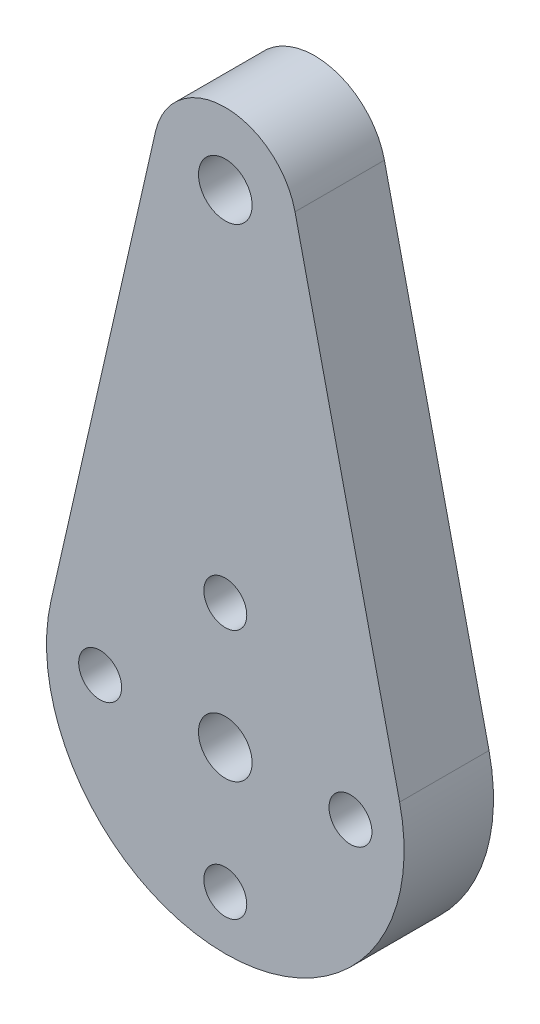
ISO-10303-21;
HEADER;
FILE_DESCRIPTION(('STEP AP214'),'2;1');
FILE_NAME('part.step','',(''),(''),'','','');
FILE_SCHEMA(('AUTOMOTIVE_DESIGN { 1 0 10303 214 1 1 1 1 }'));
ENDSEC;
DATA;
#1=APPLICATION_CONTEXT('core data for automotive mechanical design processes');
#2=APPLICATION_PROTOCOL_DEFINITION('international standard','automotive_design',2000,#1);
#3=PRODUCT_CONTEXT('',#1,'mechanical');
#4=PRODUCT('Part','Part','',(#3));
#5=PRODUCT_RELATED_PRODUCT_CATEGORY('part','',(#4));
#6=PRODUCT_DEFINITION_FORMATION('','',#4);
#7=PRODUCT_DEFINITION_CONTEXT('part definition',#1,'design');
#8=PRODUCT_DEFINITION('design','',#6,#7);
#9=PRODUCT_DEFINITION_SHAPE('','',#8);
#10=(LENGTH_UNIT() NAMED_UNIT(*) SI_UNIT(.MILLI.,.METRE.));
#11=(NAMED_UNIT(*) PLANE_ANGLE_UNIT() SI_UNIT($,.RADIAN.));
#12=(NAMED_UNIT(*) SI_UNIT($,.STERADIAN.) SOLID_ANGLE_UNIT());
#13=UNCERTAINTY_MEASURE_WITH_UNIT(LENGTH_MEASURE(1.E-05),#10,'distance_accuracy_value','');
#14=(GEOMETRIC_REPRESENTATION_CONTEXT(3) GLOBAL_UNCERTAINTY_ASSIGNED_CONTEXT((#13)) GLOBAL_UNIT_ASSIGNED_CONTEXT((#10,
#11,#12)) REPRESENTATION_CONTEXT('',''));
#15=CARTESIAN_POINT('',(0.,0.,0.));
#16=DIRECTION('',(0.,0.,1.));
#17=DIRECTION('',(1.,0.,0.));
#18=AXIS2_PLACEMENT_3D('',#15,#16,#17);
#19=CARTESIAN_POINT('',(0.,0.,5.));
#20=DIRECTION('',(0.,0.,-1.));
#21=DIRECTION('',(-1.,0.,0.));
#22=AXIS2_PLACEMENT_3D('',#19,#20,#21);
#23=CYLINDRICAL_SURFACE('',#22,10.);
#24=CARTESIAN_POINT('',(0.,0.,0.));
#25=DIRECTION('',(0.,0.,1.));
#26=DIRECTION('',(1.,0.,0.));
#27=AXIS2_PLACEMENT_3D('',#24,#25,#26);
#28=CIRCLE('',#27,10.);
#29=CARTESIAN_POINT('',(-9.74996043043569,2.22222222222222,0.));
#30=VERTEX_POINT('',#29);
#31=CARTESIAN_POINT('',(9.74996043043569,2.22222222222222,0.));
#32=VERTEX_POINT('',#31);
#33=EDGE_CURVE('E120',#30,#32,#28,.T.);
#34=ORIENTED_EDGE('',*,*,#33,.T.);
#35=DIRECTION('',(0.,0.,-1.));
#36=VECTOR('',#35,1.);
#37=CARTESIAN_POINT('',(9.74996043043569,2.22222222222222,5.));
#38=LINE('',#37,#36);
#39=CARTESIAN_POINT('',(9.74996043043569,2.22222222222222,5.));
#40=VERTEX_POINT('',#39);
#41=EDGE_CURVE('E11',#40,#32,#38,.T.);
#42=ORIENTED_EDGE('',*,*,#41,.F.);
#43=CARTESIAN_POINT('',(0.,0.,5.));
#44=DIRECTION('',(0.,0.,1.));
#45=DIRECTION('',(1.,0.,0.));
#46=AXIS2_PLACEMENT_3D('',#43,#44,#45);
#47=CIRCLE('',#46,10.);
#48=CARTESIAN_POINT('',(-9.74996043043569,2.22222222222222,5.));
#49=VERTEX_POINT('',#48);
#50=EDGE_CURVE('E88',#49,#40,#47,.T.);
#51=ORIENTED_EDGE('',*,*,#50,.F.);
#52=DIRECTION('',(0.,0.,-1.));
#53=VECTOR('',#52,1.);
#54=CARTESIAN_POINT('',(-9.74996043043569,2.22222222222222,5.));
#55=LINE('',#54,#53);
#56=EDGE_CURVE('E63',#49,#30,#55,.T.);
#57=ORIENTED_EDGE('',*,*,#56,.T.);
#58=EDGE_LOOP('',(#34,#42,#51,#57));
#59=FACE_BOUND('',#58,.T.);
#60=ADVANCED_FACE('F44',(#59),#23,.T.);
#61=CARTESIAN_POINT('',(9.7499604304357,2.22222222222222,5.));
#62=DIRECTION('',(0.974996043043569,0.222222222222222,0.));
#63=DIRECTION('',(-0.222222222222222,0.974996043043569,0.));
#64=AXIS2_PLACEMENT_3D('',#61,#62,#63);
#65=PLANE('',#64);
#66=DIRECTION('',(0.222222222222222,-0.974996043043569,0.));
#67=VECTOR('',#66,1.);
#68=CARTESIAN_POINT('',(9.7499604304357,2.22222222222222,0.));
#69=LINE('',#68,#67);
#70=CARTESIAN_POINT('',(3.89998417217428,27.8888888888889,0.));
#71=VERTEX_POINT('',#70);
#72=EDGE_CURVE('E98',#71,#32,#69,.T.);
#73=ORIENTED_EDGE('',*,*,#72,.F.);
#74=DIRECTION('',(0.,0.,-1.));
#75=VECTOR('',#74,1.);
#76=CARTESIAN_POINT('',(3.89998417217428,27.8888888888889,5.));
#77=LINE('',#76,#75);
#78=CARTESIAN_POINT('',(3.89998417217428,27.8888888888889,5.));
#79=VERTEX_POINT('',#78);
#80=EDGE_CURVE('E54',#79,#71,#77,.T.);
#81=ORIENTED_EDGE('',*,*,#80,.F.);
#82=DIRECTION('',(0.222222222222222,-0.974996043043569,0.));
#83=VECTOR('',#82,1.);
#84=CARTESIAN_POINT('',(9.7499604304357,2.22222222222222,5.));
#85=LINE('',#84,#83);
#86=EDGE_CURVE('E96',#79,#40,#85,.T.);
#87=ORIENTED_EDGE('',*,*,#86,.T.);
#88=ORIENTED_EDGE('',*,*,#41,.T.);
#89=EDGE_LOOP('',(#73,#81,#87,#88));
#90=FACE_BOUND('',#89,.T.);
#91=ADVANCED_FACE('F95',(#90),#65,.T.);
#92=CARTESIAN_POINT('',(0.,27.,5.));
#93=DIRECTION('',(0.,0.,-1.));
#94=DIRECTION('',(-1.,0.,0.));
#95=AXIS2_PLACEMENT_3D('',#92,#93,#94);
#96=CYLINDRICAL_SURFACE('',#95,4.);
#97=CARTESIAN_POINT('',(0.,27.,0.));
#98=DIRECTION('',(0.,0.,1.));
#99=DIRECTION('',(1.,0.,0.));
#100=AXIS2_PLACEMENT_3D('',#97,#98,#99);
#101=CIRCLE('',#100,4.);
#102=CARTESIAN_POINT('',(-3.89998417217428,27.8888888888889,0.));
#103=VERTEX_POINT('',#102);
#104=EDGE_CURVE('E123',#71,#103,#101,.T.);
#105=ORIENTED_EDGE('',*,*,#104,.T.);
#106=DIRECTION('',(0.,0.,-1.));
#107=VECTOR('',#106,1.);
#108=CARTESIAN_POINT('',(-3.89998417217428,27.8888888888889,5.));
#109=LINE('',#108,#107);
#110=CARTESIAN_POINT('',(-3.89998417217428,27.8888888888889,5.));
#111=VERTEX_POINT('',#110);
#112=EDGE_CURVE('E77',#111,#103,#109,.T.);
#113=ORIENTED_EDGE('',*,*,#112,.F.);
#114=CARTESIAN_POINT('',(0.,27.,5.));
#115=DIRECTION('',(0.,0.,1.));
#116=DIRECTION('',(1.,0.,0.));
#117=AXIS2_PLACEMENT_3D('',#114,#115,#116);
#118=CIRCLE('',#117,4.);
#119=EDGE_CURVE('E102',#79,#111,#118,.T.);
#120=ORIENTED_EDGE('',*,*,#119,.F.);
#121=ORIENTED_EDGE('',*,*,#80,.T.);
#122=EDGE_LOOP('',(#105,#113,#120,#121));
#123=FACE_BOUND('',#122,.T.);
#124=ADVANCED_FACE('F103',(#123),#96,.T.);
#125=CARTESIAN_POINT('',(-9.74996043043569,2.22222222222222,5.));
#126=DIRECTION('',(-0.974996043043569,0.222222222222222,0.));
#127=DIRECTION('',(-0.222222222222222,-0.974996043043569,0.));
#128=AXIS2_PLACEMENT_3D('',#125,#126,#127);
#129=PLANE('',#128);
#130=DIRECTION('',(0.222222222222222,0.974996043043569,0.));
#131=VECTOR('',#130,1.);
#132=CARTESIAN_POINT('',(-9.74996043043569,2.22222222222222,0.));
#133=LINE('',#132,#131);
#134=EDGE_CURVE('E125',#30,#103,#133,.T.);
#135=ORIENTED_EDGE('',*,*,#134,.F.);
#136=ORIENTED_EDGE('',*,*,#56,.F.);
#137=DIRECTION('',(0.222222222222222,0.974996043043569,0.));
#138=VECTOR('',#137,1.);
#139=CARTESIAN_POINT('',(-9.74996043043569,2.22222222222222,5.));
#140=LINE('',#139,#138);
#141=EDGE_CURVE('E104',#49,#111,#140,.T.);
#142=ORIENTED_EDGE('',*,*,#141,.T.);
#143=ORIENTED_EDGE('',*,*,#112,.T.);
#144=EDGE_LOOP('',(#135,#136,#142,#143));
#145=FACE_BOUND('',#144,.T.);
#146=ADVANCED_FACE('F168',(#145),#129,.T.);
#147=CARTESIAN_POINT('',(0.,0.,5.));
#148=DIRECTION('',(0.,0.,-1.));
#149=DIRECTION('',(-1.,0.,0.));
#150=AXIS2_PLACEMENT_3D('',#147,#148,#149);
#151=CYLINDRICAL_SURFACE('',#150,1.5);
#152=CARTESIAN_POINT('',(0.,0.,5.));
#153=DIRECTION('',(0.,0.,1.));
#154=DIRECTION('',(1.,0.,0.));
#155=AXIS2_PLACEMENT_3D('',#152,#153,#154);
#156=CIRCLE('',#155,1.5);
#157=CARTESIAN_POINT('',(1.5,0.,5.));
#158=VERTEX_POINT('',#157);
#159=EDGE_CURVE('E109',#158,#158,#156,.T.);
#160=ORIENTED_EDGE('',*,*,#159,.T.);
#161=EDGE_LOOP('',(#160));
#162=FACE_BOUND('',#161,.T.);
#163=CARTESIAN_POINT('',(0.,0.,0.));
#164=DIRECTION('',(0.,0.,1.));
#165=DIRECTION('',(1.,0.,0.));
#166=AXIS2_PLACEMENT_3D('',#163,#164,#165);
#167=CIRCLE('',#166,1.5);
#168=CARTESIAN_POINT('',(1.5,0.,0.));
#169=VERTEX_POINT('',#168);
#170=EDGE_CURVE('E117',#169,#169,#167,.T.);
#171=ORIENTED_EDGE('',*,*,#170,.F.);
#172=EDGE_LOOP('',(#171));
#173=FACE_BOUND('',#172,.T.);
#174=ADVANCED_FACE('F46',(#162,#173),#151,.F.);
#175=CARTESIAN_POINT('',(0.,27.,5.));
#176=DIRECTION('',(0.,0.,-1.));
#177=DIRECTION('',(-1.,0.,0.));
#178=AXIS2_PLACEMENT_3D('',#175,#176,#177);
#179=CYLINDRICAL_SURFACE('',#178,1.5);
#180=CARTESIAN_POINT('',(0.,27.,5.));
#181=DIRECTION('',(0.,0.,1.));
#182=DIRECTION('',(1.,0.,0.));
#183=AXIS2_PLACEMENT_3D('',#180,#181,#182);
#184=CIRCLE('',#183,1.5);
#185=CARTESIAN_POINT('',(1.5,27.,5.));
#186=VERTEX_POINT('',#185);
#187=EDGE_CURVE('E114',#186,#186,#184,.T.);
#188=ORIENTED_EDGE('',*,*,#187,.T.);
#189=EDGE_LOOP('',(#188));
#190=FACE_BOUND('',#189,.T.);
#191=CARTESIAN_POINT('',(0.,27.,0.));
#192=DIRECTION('',(0.,0.,1.));
#193=DIRECTION('',(1.,0.,0.));
#194=AXIS2_PLACEMENT_3D('',#191,#192,#193);
#195=CIRCLE('',#194,1.5);
#196=CARTESIAN_POINT('',(1.5,27.,0.));
#197=VERTEX_POINT('',#196);
#198=EDGE_CURVE('E128',#197,#197,#195,.T.);
#199=ORIENTED_EDGE('',*,*,#198,.F.);
#200=EDGE_LOOP('',(#199));
#201=FACE_BOUND('',#200,.T.);
#202=ADVANCED_FACE('F171',(#190,#201),#179,.F.);
#203=CARTESIAN_POINT('',(0.,0.,5.));
#204=DIRECTION('',(0.,0.,1.));
#205=DIRECTION('',(1.,0.,0.));
#206=AXIS2_PLACEMENT_3D('',#203,#204,#205);
#207=PLANE('',#206);
#208=CARTESIAN_POINT('',(0.,7.,5.));
#209=DIRECTION('',(0.,0.,1.));
#210=DIRECTION('',(1.,0.,0.));
#211=AXIS2_PLACEMENT_3D('',#208,#209,#210);
#212=CIRCLE('',#211,1.2);
#213=CARTESIAN_POINT('',(1.2,7.,5.));
#214=VERTEX_POINT('',#213);
#215=EDGE_CURVE('E137',#214,#214,#212,.T.);
#216=ORIENTED_EDGE('',*,*,#215,.F.);
#217=EDGE_LOOP('',(#216));
#218=FACE_BOUND('',#217,.T.);
#219=CARTESIAN_POINT('',(-6.9999999999998,-1.98625837999344E-13,5.));
#220=DIRECTION('',(0.,0.,1.));
#221=DIRECTION('',(1.,0.,0.));
#222=AXIS2_PLACEMENT_3D('',#219,#220,#221);
#223=CIRCLE('',#222,1.20000000000032);
#224=CARTESIAN_POINT('',(-5.79999999999948,-1.98625837999344E-13,5.));
#225=VERTEX_POINT('',#224);
#226=EDGE_CURVE('E215',#225,#225,#223,.T.);
#227=ORIENTED_EDGE('',*,*,#226,.F.);
#228=EDGE_LOOP('',(#227));
#229=FACE_BOUND('',#228,.T.);
#230=CARTESIAN_POINT('',(3.95516952522712E-13,-7.,5.));
#231=DIRECTION('',(0.,0.,1.));
#232=DIRECTION('',(1.,0.,0.));
#233=AXIS2_PLACEMENT_3D('',#230,#231,#232);
#234=CIRCLE('',#233,1.20000000000043);
#235=CARTESIAN_POINT('',(1.20000000000082,-7.,5.));
#236=VERTEX_POINT('',#235);
#237=EDGE_CURVE('E191',#236,#236,#234,.T.);
#238=ORIENTED_EDGE('',*,*,#237,.F.);
#239=EDGE_LOOP('',(#238));
#240=FACE_BOUND('',#239,.T.);
#241=CARTESIAN_POINT('',(7.0000000000002,1.97758476261356E-13,5.));
#242=DIRECTION('',(0.,0.,1.));
#243=DIRECTION('',(1.,0.,0.));
#244=AXIS2_PLACEMENT_3D('',#241,#242,#243);
#245=CIRCLE('',#244,1.20000000000016);
#246=CARTESIAN_POINT('',(8.20000000000035,1.97758476261356E-13,5.));
#247=VERTEX_POINT('',#246);
#248=EDGE_CURVE('E211',#247,#247,#245,.T.);
#249=ORIENTED_EDGE('',*,*,#248,.F.);
#250=EDGE_LOOP('',(#249));
#251=FACE_BOUND('',#250,.T.);
#252=ORIENTED_EDGE('',*,*,#159,.F.);
#253=EDGE_LOOP('',(#252));
#254=FACE_BOUND('',#253,.T.);
#255=ORIENTED_EDGE('',*,*,#50,.T.);
#256=ORIENTED_EDGE('',*,*,#86,.F.);
#257=ORIENTED_EDGE('',*,*,#119,.T.);
#258=ORIENTED_EDGE('',*,*,#141,.F.);
#259=EDGE_LOOP('',(#255,#256,#257,#258));
#260=FACE_BOUND('',#259,.T.);
#261=ORIENTED_EDGE('',*,*,#187,.F.);
#262=EDGE_LOOP('',(#261));
#263=FACE_BOUND('',#262,.T.);
#264=ADVANCED_FACE('F106',(#218,#229,#240,#251,#254,#260,#263),#207,.T.);
#265=CARTESIAN_POINT('',(0.,0.,0.));
#266=DIRECTION('',(0.,0.,1.));
#267=DIRECTION('',(1.,0.,0.));
#268=AXIS2_PLACEMENT_3D('',#265,#266,#267);
#269=PLANE('',#268);
#270=CARTESIAN_POINT('',(0.,7.,0.));
#271=DIRECTION('',(0.,0.,1.));
#272=DIRECTION('',(1.,0.,0.));
#273=AXIS2_PLACEMENT_3D('',#270,#271,#272);
#274=CIRCLE('',#273,1.2);
#275=CARTESIAN_POINT('',(1.2,7.,0.));
#276=VERTEX_POINT('',#275);
#277=EDGE_CURVE('E48',#276,#276,#274,.T.);
#278=ORIENTED_EDGE('',*,*,#277,.T.);
#279=EDGE_LOOP('',(#278));
#280=FACE_BOUND('',#279,.T.);
#281=CARTESIAN_POINT('',(-6.9999999999998,-1.98625837999344E-13,0.));
#282=DIRECTION('',(0.,0.,1.));
#283=DIRECTION('',(1.,0.,0.));
#284=AXIS2_PLACEMENT_3D('',#281,#282,#283);
#285=CIRCLE('',#284,1.20000000000032);
#286=CARTESIAN_POINT('',(-5.79999999999948,-1.98625837999344E-13,0.));
#287=VERTEX_POINT('',#286);
#288=EDGE_CURVE('E139',#287,#287,#285,.T.);
#289=ORIENTED_EDGE('',*,*,#288,.T.);
#290=EDGE_LOOP('',(#289));
#291=FACE_BOUND('',#290,.T.);
#292=CARTESIAN_POINT('',(3.95516952522712E-13,-7.,0.));
#293=DIRECTION('',(0.,0.,1.));
#294=DIRECTION('',(1.,0.,0.));
#295=AXIS2_PLACEMENT_3D('',#292,#293,#294);
#296=CIRCLE('',#295,1.20000000000043);
#297=CARTESIAN_POINT('',(1.20000000000082,-7.,0.));
#298=VERTEX_POINT('',#297);
#299=EDGE_CURVE('E136',#298,#298,#296,.T.);
#300=ORIENTED_EDGE('',*,*,#299,.T.);
#301=EDGE_LOOP('',(#300));
#302=FACE_BOUND('',#301,.T.);
#303=CARTESIAN_POINT('',(7.0000000000002,1.97758476261356E-13,0.));
#304=DIRECTION('',(0.,0.,1.));
#305=DIRECTION('',(1.,0.,0.));
#306=AXIS2_PLACEMENT_3D('',#303,#304,#305);
#307=CIRCLE('',#306,1.20000000000016);
#308=CARTESIAN_POINT('',(8.20000000000035,1.97758476261356E-13,0.));
#309=VERTEX_POINT('',#308);
#310=EDGE_CURVE('E133',#309,#309,#307,.T.);
#311=ORIENTED_EDGE('',*,*,#310,.T.);
#312=EDGE_LOOP('',(#311));
#313=FACE_BOUND('',#312,.T.);
#314=ORIENTED_EDGE('',*,*,#170,.T.);
#315=EDGE_LOOP('',(#314));
#316=FACE_BOUND('',#315,.T.);
#317=ORIENTED_EDGE('',*,*,#33,.F.);
#318=ORIENTED_EDGE('',*,*,#134,.T.);
#319=ORIENTED_EDGE('',*,*,#104,.F.);
#320=ORIENTED_EDGE('',*,*,#72,.T.);
#321=EDGE_LOOP('',(#317,#318,#319,#320));
#322=FACE_BOUND('',#321,.T.);
#323=ORIENTED_EDGE('',*,*,#198,.T.);
#324=EDGE_LOOP('',(#323));
#325=FACE_BOUND('',#324,.T.);
#326=ADVANCED_FACE('F146',(#280,#291,#302,#313,#316,#322,#325),#269,.F.);
#327=CARTESIAN_POINT('',(7.0000000000002,1.97758476261356E-13,-5.));
#328=DIRECTION('',(0.,0.,1.));
#329=DIRECTION('',(1.,0.,0.));
#330=AXIS2_PLACEMENT_3D('',#327,#328,#329);
#331=CYLINDRICAL_SURFACE('',#330,1.20000000000016);
#332=ORIENTED_EDGE('',*,*,#248,.T.);
#333=EDGE_LOOP('',(#332));
#334=FACE_BOUND('',#333,.T.);
#335=ORIENTED_EDGE('',*,*,#310,.F.);
#336=EDGE_LOOP('',(#335));
#337=FACE_BOUND('',#336,.T.);
#338=ADVANCED_FACE('F177',(#334,#337),#331,.F.);
#339=CARTESIAN_POINT('',(3.95516952522712E-13,-7.,-5.));
#340=DIRECTION('',(0.,0.,1.));
#341=DIRECTION('',(1.,0.,0.));
#342=AXIS2_PLACEMENT_3D('',#339,#340,#341);
#343=CYLINDRICAL_SURFACE('',#342,1.20000000000043);
#344=ORIENTED_EDGE('',*,*,#237,.T.);
#345=EDGE_LOOP('',(#344));
#346=FACE_BOUND('',#345,.T.);
#347=ORIENTED_EDGE('',*,*,#299,.F.);
#348=EDGE_LOOP('',(#347));
#349=FACE_BOUND('',#348,.T.);
#350=ADVANCED_FACE('F156',(#346,#349),#343,.F.);
#351=CARTESIAN_POINT('',(-6.9999999999998,-1.98625837999344E-13,-5.));
#352=DIRECTION('',(0.,0.,1.));
#353=DIRECTION('',(1.,0.,0.));
#354=AXIS2_PLACEMENT_3D('',#351,#352,#353);
#355=CYLINDRICAL_SURFACE('',#354,1.20000000000032);
#356=ORIENTED_EDGE('',*,*,#226,.T.);
#357=EDGE_LOOP('',(#356));
#358=FACE_BOUND('',#357,.T.);
#359=ORIENTED_EDGE('',*,*,#288,.F.);
#360=EDGE_LOOP('',(#359));
#361=FACE_BOUND('',#360,.T.);
#362=ADVANCED_FACE('F150',(#358,#361),#355,.F.);
#363=CARTESIAN_POINT('',(0.,7.,-5.));
#364=DIRECTION('',(0.,0.,1.));
#365=DIRECTION('',(1.,0.,0.));
#366=AXIS2_PLACEMENT_3D('',#363,#364,#365);
#367=CYLINDRICAL_SURFACE('',#366,1.2);
#368=ORIENTED_EDGE('',*,*,#215,.T.);
#369=EDGE_LOOP('',(#368));
#370=FACE_BOUND('',#369,.T.);
#371=ORIENTED_EDGE('',*,*,#277,.F.);
#372=EDGE_LOOP('',(#371));
#373=FACE_BOUND('',#372,.T.);
#374=ADVANCED_FACE('F148',(#370,#373),#367,.F.);
#375=CLOSED_SHELL('',(#60,#91,#124,#146,#174,#202,#264,#326,#338,#350,#362,#374));
#376=MANIFOLD_SOLID_BREP('B2',#375);
#377=ADVANCED_BREP_SHAPE_REPRESENTATION('',(#18,#376),#14);
#378=SHAPE_DEFINITION_REPRESENTATION(#9,#377);
ENDSEC;
END-ISO-10303-21;
